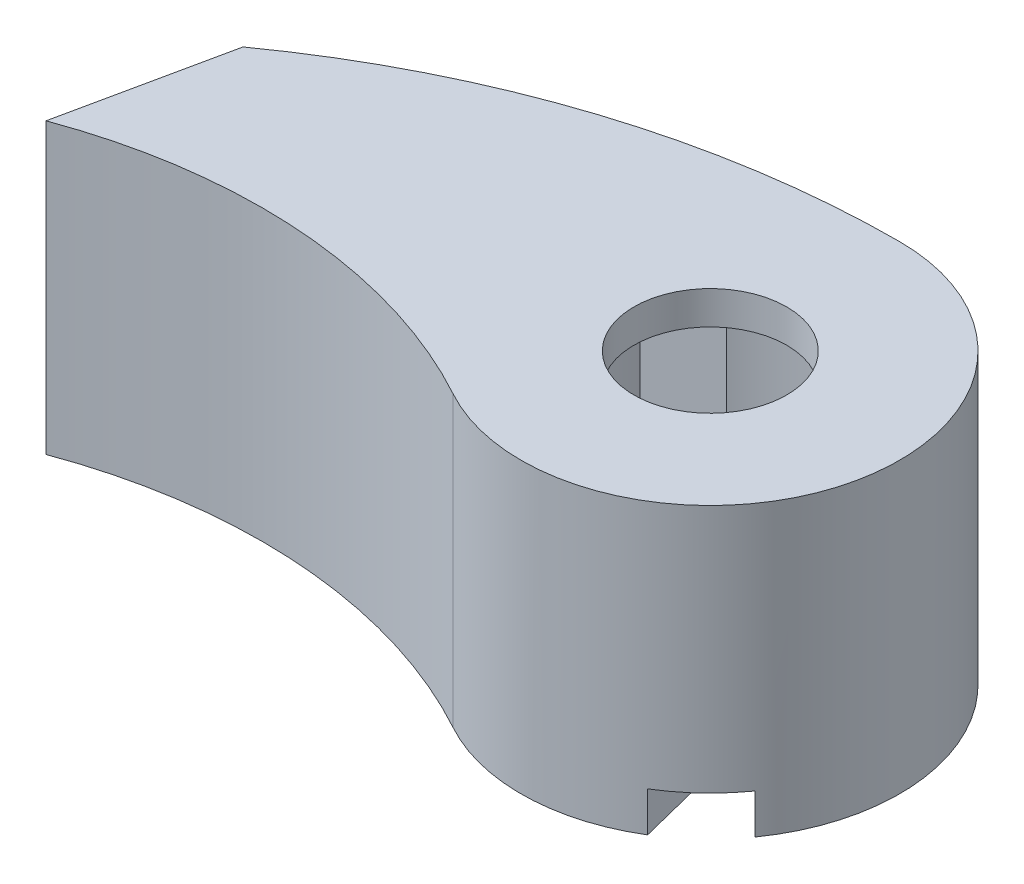
ISO-10303-21;
HEADER;
FILE_DESCRIPTION(('STEP AP214'),'2;1');
FILE_NAME('part.step','',(''),(''),'','','');
FILE_SCHEMA(('AUTOMOTIVE_DESIGN { 1 0 10303 214 1 1 1 1 }'));
ENDSEC;
DATA;
#1=APPLICATION_CONTEXT('core data for automotive mechanical design processes');
#2=APPLICATION_PROTOCOL_DEFINITION('international standard','automotive_design',2000,#1);
#3=PRODUCT_CONTEXT('',#1,'mechanical');
#4=PRODUCT('Part','Part','',(#3));
#5=PRODUCT_RELATED_PRODUCT_CATEGORY('part','',(#4));
#6=PRODUCT_DEFINITION_FORMATION('','',#4);
#7=PRODUCT_DEFINITION_CONTEXT('part definition',#1,'design');
#8=PRODUCT_DEFINITION('design','',#6,#7);
#9=PRODUCT_DEFINITION_SHAPE('','',#8);
#10=(LENGTH_UNIT() NAMED_UNIT(*) SI_UNIT(.MILLI.,.METRE.));
#11=(NAMED_UNIT(*) PLANE_ANGLE_UNIT() SI_UNIT($,.RADIAN.));
#12=(NAMED_UNIT(*) SI_UNIT($,.STERADIAN.) SOLID_ANGLE_UNIT());
#13=UNCERTAINTY_MEASURE_WITH_UNIT(LENGTH_MEASURE(1.E-05),#10,'distance_accuracy_value','');
#14=(GEOMETRIC_REPRESENTATION_CONTEXT(3) GLOBAL_UNCERTAINTY_ASSIGNED_CONTEXT((#13)) GLOBAL_UNIT_ASSIGNED_CONTEXT((#10,
#11,#12)) REPRESENTATION_CONTEXT('',''));
#15=CARTESIAN_POINT('',(0.,0.,0.));
#16=DIRECTION('',(0.,0.,1.));
#17=DIRECTION('',(1.,0.,0.));
#18=AXIS2_PLACEMENT_3D('',#15,#16,#17);
#19=CARTESIAN_POINT('',(0.,0.5,0.));
#20=DIRECTION('',(0.,-1.,0.));
#21=DIRECTION('',(0.,0.,-1.));
#22=AXIS2_PLACEMENT_3D('',#19,#20,#21);
#23=CYLINDRICAL_SURFACE('',#22,2.85);
#24=CARTESIAN_POINT('',(0.,-3.25,0.));
#25=DIRECTION('',(0.,-1.,0.));
#26=DIRECTION('',(0.,0.,-1.));
#27=AXIS2_PLACEMENT_3D('',#24,#25,#26);
#28=CIRCLE('',#27,2.85);
#29=CARTESIAN_POINT('',(2.3222915579861,-3.25,1.6521083256574));
#30=VERTEX_POINT('',#29);
#31=CARTESIAN_POINT('',(1.48692433993762,-3.25,2.43136916310565));
#32=VERTEX_POINT('',#31);
#33=EDGE_CURVE('E137',#30,#32,#28,.T.);
#34=ORIENTED_EDGE('',*,*,#33,.F.);
#35=DIRECTION('',(0.,-1.,0.));
#36=VECTOR('',#35,1.);
#37=CARTESIAN_POINT('',(2.3222915579861,-3.25,1.6521083256574));
#38=LINE('',#37,#36);
#39=CARTESIAN_POINT('',(2.3222915579861,-3.85,1.6521083256574));
#40=VERTEX_POINT('',#39);
#41=EDGE_CURVE('E157',#30,#40,#38,.T.);
#42=ORIENTED_EDGE('',*,*,#41,.T.);
#43=CARTESIAN_POINT('',(0.,-3.85,0.));
#44=DIRECTION('',(0.,1.,0.));
#45=DIRECTION('',(0.,0.,-1.));
#46=AXIS2_PLACEMENT_3D('',#43,#44,#45);
#47=CIRCLE('',#46,2.85);
#48=CARTESIAN_POINT('',(0.,-3.85,-2.85));
#49=VERTEX_POINT('',#48);
#50=EDGE_CURVE('E221',#40,#49,#47,.T.);
#51=ORIENTED_EDGE('',*,*,#50,.T.);
#52=DIRECTION('',(0.,-1.,0.));
#53=VECTOR('',#52,1.);
#54=CARTESIAN_POINT('',(0.,0.5,-2.85));
#55=LINE('',#54,#53);
#56=CARTESIAN_POINT('',(0.,0.5,-2.85));
#57=VERTEX_POINT('',#56);
#58=EDGE_CURVE('E253',#57,#49,#55,.T.);
#59=ORIENTED_EDGE('',*,*,#58,.F.);
#60=CARTESIAN_POINT('',(0.,0.5,0.));
#61=DIRECTION('',(0.,-1.,0.));
#62=DIRECTION('',(0.,0.,-1.));
#63=AXIS2_PLACEMENT_3D('',#60,#61,#62);
#64=CIRCLE('',#63,2.85);
#65=CARTESIAN_POINT('',(-1.37410867767501,0.5,2.49686310035975));
#66=VERTEX_POINT('',#65);
#67=EDGE_CURVE('E240',#57,#66,#64,.T.);
#68=ORIENTED_EDGE('',*,*,#67,.T.);
#69=DIRECTION('',(0.,-1.,0.));
#70=VECTOR('',#69,1.);
#71=CARTESIAN_POINT('',(-1.37410867767501,0.5,2.49686310035975));
#72=LINE('',#71,#70);
#73=CARTESIAN_POINT('',(-1.37410867767502,-3.85,2.49686310035977));
#74=VERTEX_POINT('',#73);
#75=EDGE_CURVE('E250',#66,#74,#72,.T.);
#76=ORIENTED_EDGE('',*,*,#75,.T.);
#77=CARTESIAN_POINT('',(1.48692433993762,-3.85,2.43136916310565));
#78=VERTEX_POINT('',#77);
#79=EDGE_CURVE('E150',#74,#78,#47,.T.);
#80=ORIENTED_EDGE('',*,*,#79,.T.);
#81=DIRECTION('',(0.,-1.,0.));
#82=VECTOR('',#81,1.);
#83=CARTESIAN_POINT('',(1.48692433993762,-3.25,2.43136916310565));
#84=LINE('',#83,#82);
#85=EDGE_CURVE('E131',#32,#78,#84,.T.);
#86=ORIENTED_EDGE('',*,*,#85,.F.);
#87=EDGE_LOOP('',(#34,#42,#51,#59,#68,#76,#80,#86));
#88=FACE_BOUND('',#87,.T.);
#89=ADVANCED_FACE('F42',(#88),#23,.T.);
#90=CARTESIAN_POINT('',(-5.2312558430786,-3.85,9.50560162768544));
#91=DIRECTION('',(0.,-1.,0.));
#92=DIRECTION('',(0.,0.,-1.));
#93=AXIS2_PLACEMENT_3D('',#90,#91,#92);
#94=PLANE('',#93);
#95=ORIENTED_EDGE('',*,*,#50,.F.);
#96=DIRECTION('',(-0.243546657191341,0.,-0.969889182211516));
#97=VECTOR('',#96,1.);
#98=CARTESIAN_POINT('',(3.72935240800581,-3.85,7.25552375695728));
#99=LINE('',#98,#97);
#100=CARTESIAN_POINT('',(1.79429498709131,-3.85,-0.450561315803984));
#101=VERTEX_POINT('',#100);
#102=EDGE_CURVE('E146',#40,#101,#99,.T.);
#103=ORIENTED_EDGE('',*,*,#102,.T.);
#104=CARTESIAN_POINT('',(0.,-3.85,0.));
#105=DIRECTION('',(0.,1.,0.));
#106=DIRECTION('',(0.,0.,-1.));
#107=AXIS2_PLACEMENT_3D('',#104,#105,#106);
#108=CIRCLE('',#107,1.85);
#109=CARTESIAN_POINT('',(-1.18190094330077,-3.85,-1.42323931937842));
#110=VERTEX_POINT('',#109);
#111=EDGE_CURVE('E181',#101,#110,#108,.T.);
#112=ORIENTED_EDGE('',*,*,#111,.T.);
#113=DIRECTION('',(-0.969889182211516,0.,0.243546657191341));
#114=VECTOR('',#113,1.);
#115=CARTESIAN_POINT('',(-6.51629144546411,-3.85,-0.0837327048260443));
#116=LINE('',#115,#114);
#117=CARTESIAN_POINT('',(-6.51629144546411,-3.85,-0.0837327048260443));
#118=VERTEX_POINT('',#117);
#119=EDGE_CURVE('E186',#110,#118,#116,.T.);
#120=ORIENTED_EDGE('',*,*,#119,.T.);
#121=DIRECTION('',(0.243546657191342,0.,0.969889182211516));
#122=VECTOR('',#121,1.);
#123=CARTESIAN_POINT('',(-6.51629144546411,-3.85,-0.0837327048260443));
#124=LINE('',#123,#122);
#125=CARTESIAN_POINT('',(-6.3701634511493,-3.85,0.498200804500866));
#126=VERTEX_POINT('',#125);
#127=EDGE_CURVE('E172',#118,#126,#124,.T.);
#128=ORIENTED_EDGE('',*,*,#127,.T.);
#129=DIRECTION('',(0.969889182211516,0.,-0.243546657191341));
#130=VECTOR('',#129,1.);
#131=CARTESIAN_POINT('',(-1.72510794940768,-3.85,-0.668208472626948));
#132=LINE('',#131,#130);
#133=CARTESIAN_POINT('',(-1.72510794940768,-3.85,-0.668208472626948));
#134=VERTEX_POINT('',#133);
#135=EDGE_CURVE('E176',#126,#134,#132,.T.);
#136=ORIENTED_EDGE('',*,*,#135,.T.);
#137=CARTESIAN_POINT('',(1.22459379872582,-3.85,1.38667589151982));
#138=VERTEX_POINT('',#137);
#139=EDGE_CURVE('E182',#134,#138,#108,.T.);
#140=ORIENTED_EDGE('',*,*,#139,.T.);
#141=DIRECTION('',(0.243546657191341,0.,0.969889182211516));
#142=VECTOR('',#141,1.);
#143=CARTESIAN_POINT('',(2.7594632257943,-3.85,7.49907041414862));
#144=LINE('',#143,#142);
#145=EDGE_CURVE('E272',#138,#78,#144,.T.);
#146=ORIENTED_EDGE('',*,*,#145,.T.);
#147=ORIENTED_EDGE('',*,*,#79,.F.);
#148=CARTESIAN_POINT('',(-5.2312558430786,-3.85,9.50560162768544));
#149=DIRECTION('',(0.,-1.,0.));
#150=DIRECTION('',(0.,0.,-1.));
#151=AXIS2_PLACEMENT_3D('',#148,#149,#150);
#152=CIRCLE('',#151,8.00000000000002);
#153=CARTESIAN_POINT('',(-8.,-3.85,2.));
#154=VERTEX_POINT('',#153);
#155=EDGE_CURVE('E206',#154,#74,#152,.T.);
#156=ORIENTED_EDGE('',*,*,#155,.F.);
#157=DIRECTION('',(-0.207911690817807,0.,0.978147600733796));
#158=VECTOR('',#157,1.);
#159=CARTESIAN_POINT('',(-8.,-3.85,2.));
#160=LINE('',#159,#158);
#161=CARTESIAN_POINT('',(-7.48022077295548,-3.85,-0.445369001834514));
#162=VERTEX_POINT('',#161);
#163=EDGE_CURVE('E228',#162,#154,#160,.T.);
#164=ORIENTED_EDGE('',*,*,#163,.F.);
#165=CARTESIAN_POINT('',(0.,-3.85,9.98688705181624));
#166=DIRECTION('',(0.,1.,0.));
#167=DIRECTION('',(0.,0.,-1.));
#168=AXIS2_PLACEMENT_3D('',#165,#166,#167);
#169=CIRCLE('',#168,12.8368870518162);
#170=EDGE_CURVE('E224',#49,#162,#169,.T.);
#171=ORIENTED_EDGE('',*,*,#170,.F.);
#172=EDGE_LOOP('',(#95,#103,#112,#120,#128,#136,#140,#146,#147,#156,#164,#171));
#173=FACE_BOUND('',#172,.T.);
#174=ADVANCED_FACE('F276',(#173),#94,.T.);
#175=CARTESIAN_POINT('',(0.,-3.85,0.));
#176=DIRECTION('',(0.,1.,0.));
#177=DIRECTION('',(0.,0.,1.));
#178=AXIS2_PLACEMENT_3D('',#175,#176,#177);
#179=CYLINDRICAL_SURFACE('',#178,1.85);
#180=DIRECTION('',(0.,-1.,0.));
#181=VECTOR('',#180,1.);
#182=CARTESIAN_POINT('',(1.79429498709131,-3.25,-0.450561315803984));
#183=LINE('',#182,#181);
#184=CARTESIAN_POINT('',(1.79429498709131,-3.25,-0.450561315803984));
#185=VERTEX_POINT('',#184);
#186=EDGE_CURVE('E152',#185,#101,#183,.T.);
#187=ORIENTED_EDGE('',*,*,#186,.F.);
#188=CARTESIAN_POINT('',(0.,-3.25,0.));
#189=DIRECTION('',(0.,-1.,0.));
#190=DIRECTION('',(0.,0.,-1.));
#191=AXIS2_PLACEMENT_3D('',#188,#189,#190);
#192=CIRCLE('',#191,1.85);
#193=CARTESIAN_POINT('',(1.22459379872582,-3.25,1.38667589151982));
#194=VERTEX_POINT('',#193);
#195=EDGE_CURVE('E51',#194,#185,#192,.F.);
#196=ORIENTED_EDGE('',*,*,#195,.F.);
#197=DIRECTION('',(0.,1.,0.));
#198=VECTOR('',#197,1.);
#199=CARTESIAN_POINT('',(1.22459379872582,-3.85,1.38667589151982));
#200=LINE('',#199,#198);
#201=EDGE_CURVE('E11',#138,#194,#200,.T.);
#202=ORIENTED_EDGE('',*,*,#201,.F.);
#203=ORIENTED_EDGE('',*,*,#139,.F.);
#204=DIRECTION('',(0.,1.,0.));
#205=VECTOR('',#204,1.);
#206=CARTESIAN_POINT('',(-1.72510794940768,-3.85,-0.668208472626949));
#207=LINE('',#206,#205);
#208=CARTESIAN_POINT('',(-1.72510794940768,0.,-0.668208472626949));
#209=VERTEX_POINT('',#208);
#210=EDGE_CURVE('E211',#134,#209,#207,.T.);
#211=ORIENTED_EDGE('',*,*,#210,.T.);
#212=CARTESIAN_POINT('',(0.,0.,0.));
#213=DIRECTION('',(0.,1.,0.));
#214=DIRECTION('',(0.,0.,-1.));
#215=AXIS2_PLACEMENT_3D('',#212,#213,#214);
#216=CIRCLE('',#215,1.85);
#217=CARTESIAN_POINT('',(-1.18190094330077,0.,-1.42323931937842));
#218=VERTEX_POINT('',#217);
#219=EDGE_CURVE('E195',#209,#218,#216,.T.);
#220=ORIENTED_EDGE('',*,*,#219,.T.);
#221=DIRECTION('',(0.,1.,0.));
#222=VECTOR('',#221,1.);
#223=CARTESIAN_POINT('',(-1.18190094330077,-3.85,-1.42323931937842));
#224=LINE('',#223,#222);
#225=EDGE_CURVE('E207',#110,#218,#224,.T.);
#226=ORIENTED_EDGE('',*,*,#225,.F.);
#227=ORIENTED_EDGE('',*,*,#111,.F.);
#228=EDGE_LOOP('',(#187,#196,#202,#203,#211,#220,#226,#227));
#229=FACE_BOUND('',#228,.T.);
#230=ADVANCED_FACE('F265',(#229),#179,.F.);
#231=CARTESIAN_POINT('',(-8.,0.5,2.));
#232=DIRECTION('',(-0.978147600733796,0.,-0.207911690817807));
#233=DIRECTION('',(-0.207911690817807,0.,0.978147600733796));
#234=AXIS2_PLACEMENT_3D('',#231,#232,#233);
#235=PLANE('',#234);
#236=DIRECTION('',(0.,-1.,0.));
#237=VECTOR('',#236,1.);
#238=CARTESIAN_POINT('',(-7.48022077295548,0.5,-0.445369001834511));
#239=LINE('',#238,#237);
#240=CARTESIAN_POINT('',(-7.48022077295548,0.5,-0.445369001834511));
#241=VERTEX_POINT('',#240);
#242=EDGE_CURVE('E246',#241,#162,#239,.T.);
#243=ORIENTED_EDGE('',*,*,#242,.T.);
#244=ORIENTED_EDGE('',*,*,#163,.T.);
#245=DIRECTION('',(0.,-1.,0.));
#246=VECTOR('',#245,1.);
#247=CARTESIAN_POINT('',(-7.99999999999999,0.5,2.00000000000002));
#248=LINE('',#247,#246);
#249=CARTESIAN_POINT('',(-7.99999999999999,0.5,2.00000000000002));
#250=VERTEX_POINT('',#249);
#251=EDGE_CURVE('E247',#250,#154,#248,.T.);
#252=ORIENTED_EDGE('',*,*,#251,.F.);
#253=DIRECTION('',(0.207911690817807,0.,-0.978147600733796));
#254=VECTOR('',#253,1.);
#255=CARTESIAN_POINT('',(-8.,0.5,2.));
#256=LINE('',#255,#254);
#257=EDGE_CURVE('E232',#250,#241,#256,.T.);
#258=ORIENTED_EDGE('',*,*,#257,.T.);
#259=EDGE_LOOP('',(#243,#244,#252,#258));
#260=FACE_BOUND('',#259,.T.);
#261=ADVANCED_FACE('F44',(#260),#235,.T.);
#262=CARTESIAN_POINT('',(-5.2312558430786,0.5,9.50560162768544));
#263=DIRECTION('',(0.,-1.,0.));
#264=DIRECTION('',(0.,0.,-1.));
#265=AXIS2_PLACEMENT_3D('',#262,#263,#264);
#266=CYLINDRICAL_SURFACE('',#265,8.00000000000002);
#267=ORIENTED_EDGE('',*,*,#251,.T.);
#268=ORIENTED_EDGE('',*,*,#155,.T.);
#269=ORIENTED_EDGE('',*,*,#75,.F.);
#270=CARTESIAN_POINT('',(-5.2312558430786,0.5,9.50560162768544));
#271=DIRECTION('',(0.,-1.,0.));
#272=DIRECTION('',(0.,0.,-1.));
#273=AXIS2_PLACEMENT_3D('',#270,#271,#272);
#274=CIRCLE('',#273,8.00000000000002);
#275=EDGE_CURVE('E244',#250,#66,#274,.T.);
#276=ORIENTED_EDGE('',*,*,#275,.F.);
#277=EDGE_LOOP('',(#267,#268,#269,#276));
#278=FACE_BOUND('',#277,.T.);
#279=ADVANCED_FACE('F292',(#278),#266,.F.);
#280=CARTESIAN_POINT('',(0.,0.5,9.98688705181624));
#281=DIRECTION('',(0.,-1.,0.));
#282=DIRECTION('',(0.,0.,-1.));
#283=AXIS2_PLACEMENT_3D('',#280,#281,#282);
#284=CYLINDRICAL_SURFACE('',#283,12.8368870518162);
#285=ORIENTED_EDGE('',*,*,#58,.T.);
#286=ORIENTED_EDGE('',*,*,#170,.T.);
#287=ORIENTED_EDGE('',*,*,#242,.F.);
#288=CARTESIAN_POINT('',(0.,0.5,9.98688705181624));
#289=DIRECTION('',(0.,-1.,0.));
#290=DIRECTION('',(0.,0.,-1.));
#291=AXIS2_PLACEMENT_3D('',#288,#289,#290);
#292=CIRCLE('',#291,12.8368870518162);
#293=EDGE_CURVE('E236',#241,#57,#292,.T.);
#294=ORIENTED_EDGE('',*,*,#293,.T.);
#295=EDGE_LOOP('',(#285,#286,#287,#294));
#296=FACE_BOUND('',#295,.T.);
#297=ADVANCED_FACE('F281',(#296),#284,.T.);
#298=CARTESIAN_POINT('',(0.,0.5,9.98688705181624));
#299=DIRECTION('',(0.,-1.,0.));
#300=DIRECTION('',(0.,0.,-1.));
#301=AXIS2_PLACEMENT_3D('',#298,#299,#300);
#302=PLANE('',#301);
#303=CARTESIAN_POINT('',(0.,0.5,0.));
#304=DIRECTION('',(0.,-1.,0.));
#305=DIRECTION('',(0.,0.,-1.));
#306=AXIS2_PLACEMENT_3D('',#303,#304,#305);
#307=CIRCLE('',#306,1.15);
#308=CARTESIAN_POINT('',(0.,0.5,-1.15));
#309=VERTEX_POINT('',#308);
#310=EDGE_CURVE('E167',#309,#309,#307,.T.);
#311=ORIENTED_EDGE('',*,*,#310,.T.);
#312=EDGE_LOOP('',(#311));
#313=FACE_BOUND('',#312,.T.);
#314=ORIENTED_EDGE('',*,*,#257,.F.);
#315=ORIENTED_EDGE('',*,*,#275,.T.);
#316=ORIENTED_EDGE('',*,*,#67,.F.);
#317=ORIENTED_EDGE('',*,*,#293,.F.);
#318=EDGE_LOOP('',(#314,#315,#316,#317));
#319=FACE_BOUND('',#318,.T.);
#320=ADVANCED_FACE('F289',(#313,#319),#302,.F.);
#321=CARTESIAN_POINT('',(-6.51629144546411,-3.85,-0.0837327048260443));
#322=DIRECTION('',(-0.969889182211516,0.,0.243546657191342));
#323=DIRECTION('',(0.243546657191342,0.,0.969889182211516));
#324=AXIS2_PLACEMENT_3D('',#321,#322,#323);
#325=PLANE('',#324);
#326=DIRECTION('',(0.243546657191342,0.,0.969889182211516));
#327=VECTOR('',#326,1.);
#328=CARTESIAN_POINT('',(-6.51629144546411,0.,-0.0837327048260443));
#329=LINE('',#328,#327);
#330=CARTESIAN_POINT('',(-6.51629144546411,0.,-0.0837327048260443));
#331=VERTEX_POINT('',#330);
#332=CARTESIAN_POINT('',(-6.3701634511493,0.,0.498200804500866));
#333=VERTEX_POINT('',#332);
#334=EDGE_CURVE('E171',#331,#333,#329,.T.);
#335=ORIENTED_EDGE('',*,*,#334,.T.);
#336=DIRECTION('',(0.,1.,0.));
#337=VECTOR('',#336,1.);
#338=CARTESIAN_POINT('',(-6.3701634511493,-3.85,0.498200804500866));
#339=LINE('',#338,#337);
#340=EDGE_CURVE('E190',#126,#333,#339,.T.);
#341=ORIENTED_EDGE('',*,*,#340,.F.);
#342=ORIENTED_EDGE('',*,*,#127,.F.);
#343=DIRECTION('',(0.,1.,0.));
#344=VECTOR('',#343,1.);
#345=CARTESIAN_POINT('',(-6.51629144546411,-3.85,-0.0837327048260443));
#346=LINE('',#345,#344);
#347=EDGE_CURVE('E202',#118,#331,#346,.T.);
#348=ORIENTED_EDGE('',*,*,#347,.T.);
#349=EDGE_LOOP('',(#335,#341,#342,#348));
#350=FACE_BOUND('',#349,.T.);
#351=ADVANCED_FACE('F312',(#350),#325,.F.);
#352=CARTESIAN_POINT('',(-6.51629144546411,-3.85,-0.0837327048260443));
#353=DIRECTION('',(-0.243546657191341,0.,-0.969889182211516));
#354=DIRECTION('',(-0.969889182211516,0.,0.243546657191341));
#355=AXIS2_PLACEMENT_3D('',#352,#353,#354);
#356=PLANE('',#355);
#357=DIRECTION('',(-0.969889182211516,0.,0.243546657191341));
#358=VECTOR('',#357,1.);
#359=CARTESIAN_POINT('',(-6.51629144546411,0.,-0.0837327048260443));
#360=LINE('',#359,#358);
#361=EDGE_CURVE('E177',#218,#331,#360,.T.);
#362=ORIENTED_EDGE('',*,*,#361,.T.);
#363=ORIENTED_EDGE('',*,*,#347,.F.);
#364=ORIENTED_EDGE('',*,*,#119,.F.);
#365=ORIENTED_EDGE('',*,*,#225,.T.);
#366=EDGE_LOOP('',(#362,#363,#364,#365));
#367=FACE_BOUND('',#366,.T.);
#368=ADVANCED_FACE('F327',(#367),#356,.F.);
#369=CARTESIAN_POINT('',(-1.72510794940768,-3.85,-0.668208472626948));
#370=DIRECTION('',(0.243546657191341,0.,0.969889182211516));
#371=DIRECTION('',(0.969889182211516,0.,-0.243546657191341));
#372=AXIS2_PLACEMENT_3D('',#369,#370,#371);
#373=PLANE('',#372);
#374=DIRECTION('',(0.969889182211516,0.,-0.243546657191341));
#375=VECTOR('',#374,1.);
#376=CARTESIAN_POINT('',(-1.72510794940768,0.,-0.668208472626948));
#377=LINE('',#376,#375);
#378=EDGE_CURVE('E65',#333,#209,#377,.T.);
#379=ORIENTED_EDGE('',*,*,#378,.T.);
#380=ORIENTED_EDGE('',*,*,#210,.F.);
#381=ORIENTED_EDGE('',*,*,#135,.F.);
#382=ORIENTED_EDGE('',*,*,#340,.T.);
#383=EDGE_LOOP('',(#379,#380,#381,#382));
#384=FACE_BOUND('',#383,.T.);
#385=ADVANCED_FACE('F319',(#384),#373,.F.);
#386=CARTESIAN_POINT('',(0.,0.,9.98688705181624));
#387=DIRECTION('',(0.,-1.,0.));
#388=DIRECTION('',(0.,0.,-1.));
#389=AXIS2_PLACEMENT_3D('',#386,#387,#388);
#390=PLANE('',#389);
#391=CARTESIAN_POINT('',(0.,0.,0.));
#392=DIRECTION('',(0.,-1.,0.));
#393=DIRECTION('',(0.,0.,-1.));
#394=AXIS2_PLACEMENT_3D('',#391,#392,#393);
#395=CIRCLE('',#394,1.15);
#396=CARTESIAN_POINT('',(0.,0.,-1.15));
#397=VERTEX_POINT('',#396);
#398=EDGE_CURVE('E163',#397,#397,#395,.T.);
#399=ORIENTED_EDGE('',*,*,#398,.F.);
#400=EDGE_LOOP('',(#399));
#401=FACE_BOUND('',#400,.T.);
#402=ORIENTED_EDGE('',*,*,#378,.F.);
#403=ORIENTED_EDGE('',*,*,#334,.F.);
#404=ORIENTED_EDGE('',*,*,#361,.F.);
#405=ORIENTED_EDGE('',*,*,#219,.F.);
#406=EDGE_LOOP('',(#402,#403,#404,#405));
#407=FACE_BOUND('',#406,.T.);
#408=ADVANCED_FACE('F316',(#401,#407),#390,.T.);
#409=CARTESIAN_POINT('',(0.,10.,0.));
#410=DIRECTION('',(0.,-1.,0.));
#411=DIRECTION('',(0.,0.,-1.));
#412=AXIS2_PLACEMENT_3D('',#409,#410,#411);
#413=CYLINDRICAL_SURFACE('',#412,1.15);
#414=ORIENTED_EDGE('',*,*,#398,.T.);
#415=EDGE_LOOP('',(#414));
#416=FACE_BOUND('',#415,.T.);
#417=ORIENTED_EDGE('',*,*,#310,.F.);
#418=EDGE_LOOP('',(#417));
#419=FACE_BOUND('',#418,.T.);
#420=ADVANCED_FACE('F318',(#416,#419),#413,.F.);
#421=CARTESIAN_POINT('',(2.7594632257943,-3.25,7.49907041414862));
#422=DIRECTION('',(0.969889182211516,0.,-0.243546657191341));
#423=DIRECTION('',(-0.243546657191341,0.,-0.969889182211516));
#424=AXIS2_PLACEMENT_3D('',#421,#422,#423);
#425=PLANE('',#424);
#426=ORIENTED_EDGE('',*,*,#201,.T.);
#427=DIRECTION('',(0.243546657191341,0.,0.969889182211516));
#428=VECTOR('',#427,1.);
#429=CARTESIAN_POINT('',(2.7594632257943,-3.25,7.49907041414862));
#430=LINE('',#429,#428);
#431=EDGE_CURVE('E58',#194,#32,#430,.T.);
#432=ORIENTED_EDGE('',*,*,#431,.T.);
#433=ORIENTED_EDGE('',*,*,#85,.T.);
#434=ORIENTED_EDGE('',*,*,#145,.F.);
#435=EDGE_LOOP('',(#426,#432,#433,#434));
#436=FACE_BOUND('',#435,.T.);
#437=ADVANCED_FACE('F129',(#436),#425,.T.);
#438=CARTESIAN_POINT('',(0.,-3.25,0.));
#439=DIRECTION('',(0.,-1.,0.));
#440=DIRECTION('',(0.,0.,-1.));
#441=AXIS2_PLACEMENT_3D('',#438,#439,#440);
#442=PLANE('',#441);
#443=ORIENTED_EDGE('',*,*,#195,.T.);
#444=DIRECTION('',(-0.243546657191341,0.,-0.969889182211516));
#445=VECTOR('',#444,1.);
#446=CARTESIAN_POINT('',(3.72935240800581,-3.25,7.25552375695728));
#447=LINE('',#446,#445);
#448=EDGE_CURVE('E136',#30,#185,#447,.T.);
#449=ORIENTED_EDGE('',*,*,#448,.F.);
#450=ORIENTED_EDGE('',*,*,#33,.T.);
#451=ORIENTED_EDGE('',*,*,#431,.F.);
#452=EDGE_LOOP('',(#443,#449,#450,#451));
#453=FACE_BOUND('',#452,.T.);
#454=ADVANCED_FACE('F141',(#453),#442,.T.);
#455=CARTESIAN_POINT('',(3.72935240800581,-3.25,7.25552375695728));
#456=DIRECTION('',(-0.969889182211516,0.,0.243546657191341));
#457=DIRECTION('',(0.243546657191341,0.,0.969889182211516));
#458=AXIS2_PLACEMENT_3D('',#455,#456,#457);
#459=PLANE('',#458);
#460=ORIENTED_EDGE('',*,*,#102,.F.);
#461=ORIENTED_EDGE('',*,*,#41,.F.);
#462=ORIENTED_EDGE('',*,*,#448,.T.);
#463=ORIENTED_EDGE('',*,*,#186,.T.);
#464=EDGE_LOOP('',(#460,#461,#462,#463));
#465=FACE_BOUND('',#464,.T.);
#466=ADVANCED_FACE('F262',(#465),#459,.T.);
#467=CLOSED_SHELL('',(#89,#174,#230,#261,#279,#297,#320,#351,#368,#385,#408,#420,#437,#454,#466));
#468=MANIFOLD_SOLID_BREP('B2',#467);
#469=ADVANCED_BREP_SHAPE_REPRESENTATION('',(#18,#468),#14);
#470=SHAPE_DEFINITION_REPRESENTATION(#9,#469);
ENDSEC;
END-ISO-10303-21;
